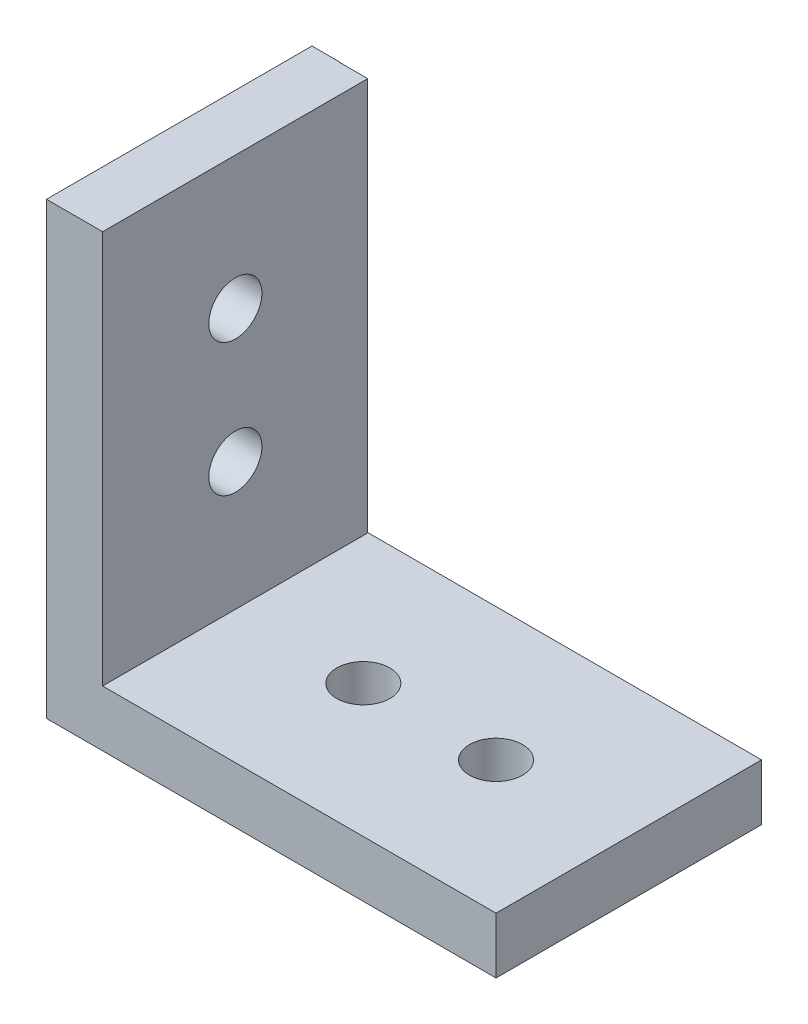
ISO-10303-21;
HEADER;
FILE_DESCRIPTION(('STEP AP214'),'2;1');
FILE_NAME('part.step','',(''),(''),'','','');
FILE_SCHEMA(('AUTOMOTIVE_DESIGN { 1 0 10303 214 1 1 1 1 }'));
ENDSEC;
DATA;
#1=APPLICATION_CONTEXT('core data for automotive mechanical design processes');
#2=APPLICATION_PROTOCOL_DEFINITION('international standard','automotive_design',2000,#1);
#3=PRODUCT_CONTEXT('',#1,'mechanical');
#4=PRODUCT('Part','Part','',(#3));
#5=PRODUCT_RELATED_PRODUCT_CATEGORY('part','',(#4));
#6=PRODUCT_DEFINITION_FORMATION('','',#4);
#7=PRODUCT_DEFINITION_CONTEXT('part definition',#1,'design');
#8=PRODUCT_DEFINITION('design','',#6,#7);
#9=PRODUCT_DEFINITION_SHAPE('','',#8);
#10=(LENGTH_UNIT() NAMED_UNIT(*) SI_UNIT(.MILLI.,.METRE.));
#11=(NAMED_UNIT(*) PLANE_ANGLE_UNIT() SI_UNIT($,.RADIAN.));
#12=(NAMED_UNIT(*) SI_UNIT($,.STERADIAN.) SOLID_ANGLE_UNIT());
#13=UNCERTAINTY_MEASURE_WITH_UNIT(LENGTH_MEASURE(1.E-05),#10,'distance_accuracy_value','');
#14=(GEOMETRIC_REPRESENTATION_CONTEXT(3) GLOBAL_UNCERTAINTY_ASSIGNED_CONTEXT((#13)) GLOBAL_UNIT_ASSIGNED_CONTEXT((#10,
#11,#12)) REPRESENTATION_CONTEXT('',''));
#15=CARTESIAN_POINT('',(0.,0.,0.));
#16=DIRECTION('',(0.,0.,1.));
#17=DIRECTION('',(1.,0.,0.));
#18=AXIS2_PLACEMENT_3D('',#15,#16,#17);
#19=CARTESIAN_POINT('',(1.5875,0.,0.));
#20=DIRECTION('',(-1.,0.,0.));
#21=DIRECTION('',(0.,0.,1.));
#22=AXIS2_PLACEMENT_3D('',#19,#20,#21);
#23=PLANE('',#22);
#24=DIRECTION('',(0.,1.,0.));
#25=VECTOR('',#24,1.);
#26=CARTESIAN_POINT('',(1.5875,25.4,-14.9789009302808));
#27=LINE('',#26,#25);
#28=CARTESIAN_POINT('',(1.5875,3.1725,-14.9789009302808));
#29=VERTEX_POINT('',#28);
#30=CARTESIAN_POINT('',(1.5875,25.4,-14.9789009302808));
#31=VERTEX_POINT('',#30);
#32=EDGE_CURVE('E115',#29,#31,#27,.T.);
#33=ORIENTED_EDGE('',*,*,#32,.F.);
#34=DIRECTION('',(0.,0.,1.));
#35=VECTOR('',#34,1.);
#36=CARTESIAN_POINT('',(1.5875,3.1725,-15.));
#37=LINE('',#36,#35);
#38=CARTESIAN_POINT('',(1.5875,3.1725,-15.));
#39=VERTEX_POINT('',#38);
#40=EDGE_CURVE('E132',#39,#29,#37,.T.);
#41=ORIENTED_EDGE('',*,*,#40,.F.);
#42=DIRECTION('',(0.,1.,0.));
#43=VECTOR('',#42,1.);
#44=CARTESIAN_POINT('',(1.5875,1.5875,-15.));
#45=LINE('',#44,#43);
#46=CARTESIAN_POINT('',(1.5875,25.4,-15.));
#47=VERTEX_POINT('',#46);
#48=EDGE_CURVE('E145',#39,#47,#45,.T.);
#49=ORIENTED_EDGE('',*,*,#48,.T.);
#50=DIRECTION('',(0.,0.,1.));
#51=VECTOR('',#50,1.);
#52=CARTESIAN_POINT('',(1.5875,25.4,0.));
#53=LINE('',#52,#51);
#54=EDGE_CURVE('E148',#47,#31,#53,.T.);
#55=ORIENTED_EDGE('',*,*,#54,.T.);
#56=EDGE_LOOP('',(#33,#41,#49,#55));
#57=FACE_BOUND('',#56,.T.);
#58=ADVANCED_FACE('F39',(#57),#23,.F.);
#59=CARTESIAN_POINT('',(3.175,0.,0.));
#60=DIRECTION('',(0.,0.,-1.));
#61=DIRECTION('',(-1.,0.,0.));
#62=AXIS2_PLACEMENT_3D('',#59,#60,#61);
#63=PLANE('',#62);
#64=DIRECTION('',(0.,-1.,0.));
#65=VECTOR('',#64,1.);
#66=CARTESIAN_POINT('',(25.4,0.,0.));
#67=LINE('',#66,#65);
#68=CARTESIAN_POINT('',(25.4,3.1725,0.));
#69=VERTEX_POINT('',#68);
#70=CARTESIAN_POINT('',(25.4,0.,0.));
#71=VERTEX_POINT('',#70);
#72=EDGE_CURVE('E128',#69,#71,#67,.T.);
#73=ORIENTED_EDGE('',*,*,#72,.F.);
#74=DIRECTION('',(1.,0.,0.));
#75=VECTOR('',#74,1.);
#76=CARTESIAN_POINT('',(1.5875,3.1725,0.));
#77=LINE('',#76,#75);
#78=CARTESIAN_POINT('',(3.1725,3.1725,0.));
#79=VERTEX_POINT('',#78);
#80=EDGE_CURVE('E121',#79,#69,#77,.T.);
#81=ORIENTED_EDGE('',*,*,#80,.F.);
#82=DIRECTION('',(0.,-1.,0.));
#83=VECTOR('',#82,1.);
#84=CARTESIAN_POINT('',(3.1725,25.4,0.));
#85=LINE('',#84,#83);
#86=CARTESIAN_POINT('',(3.1725,25.4,0.));
#87=VERTEX_POINT('',#86);
#88=EDGE_CURVE('E105',#87,#79,#85,.T.);
#89=ORIENTED_EDGE('',*,*,#88,.F.);
#90=DIRECTION('',(-1.,0.,0.));
#91=VECTOR('',#90,1.);
#92=CARTESIAN_POINT('',(3.175,25.4,0.));
#93=LINE('',#92,#91);
#94=CARTESIAN_POINT('',(0.,25.4,0.));
#95=VERTEX_POINT('',#94);
#96=EDGE_CURVE('E63',#87,#95,#93,.T.);
#97=ORIENTED_EDGE('',*,*,#96,.T.);
#98=DIRECTION('',(0.,-1.,0.));
#99=VECTOR('',#98,1.);
#100=CARTESIAN_POINT('',(0.,0.,0.));
#101=LINE('',#100,#99);
#102=CARTESIAN_POINT('',(0.,0.,0.));
#103=VERTEX_POINT('',#102);
#104=EDGE_CURVE('E177',#95,#103,#101,.T.);
#105=ORIENTED_EDGE('',*,*,#104,.T.);
#106=DIRECTION('',(-1.,0.,0.));
#107=VECTOR('',#106,1.);
#108=CARTESIAN_POINT('',(3.175,0.,0.));
#109=LINE('',#108,#107);
#110=EDGE_CURVE('E11',#71,#103,#109,.T.);
#111=ORIENTED_EDGE('',*,*,#110,.F.);
#112=EDGE_LOOP('',(#73,#81,#89,#97,#105,#111));
#113=FACE_BOUND('',#112,.T.);
#114=ADVANCED_FACE('F41',(#113),#63,.F.);
#115=CARTESIAN_POINT('',(3.175,0.,0.));
#116=DIRECTION('',(0.,1.,0.));
#117=DIRECTION('',(0.,0.,1.));
#118=AXIS2_PLACEMENT_3D('',#115,#116,#117);
#119=PLANE('',#118);
#120=CARTESIAN_POINT('',(10.4,0.,-7.5));
#121=DIRECTION('',(0.,-1.,0.));
#122=DIRECTION('',(0.,0.,-1.));
#123=AXIS2_PLACEMENT_3D('',#120,#121,#122);
#124=CIRCLE('',#123,1.5);
#125=CARTESIAN_POINT('',(10.4,0.,-9.));
#126=VERTEX_POINT('',#125);
#127=EDGE_CURVE('E153',#126,#126,#124,.T.);
#128=ORIENTED_EDGE('',*,*,#127,.F.);
#129=EDGE_LOOP('',(#128));
#130=FACE_BOUND('',#129,.T.);
#131=CARTESIAN_POINT('',(17.9,0.,-7.5));
#132=DIRECTION('',(0.,-1.,0.));
#133=DIRECTION('',(0.,0.,-1.));
#134=AXIS2_PLACEMENT_3D('',#131,#132,#133);
#135=CIRCLE('',#134,1.5);
#136=CARTESIAN_POINT('',(17.9,0.,-9.));
#137=VERTEX_POINT('',#136);
#138=EDGE_CURVE('E152',#137,#137,#135,.T.);
#139=ORIENTED_EDGE('',*,*,#138,.F.);
#140=EDGE_LOOP('',(#139));
#141=FACE_BOUND('',#140,.T.);
#142=DIRECTION('',(0.,0.,-1.));
#143=VECTOR('',#142,1.);
#144=CARTESIAN_POINT('',(0.,0.,0.));
#145=LINE('',#144,#143);
#146=CARTESIAN_POINT('',(0.,0.,-15.));
#147=VERTEX_POINT('',#146);
#148=EDGE_CURVE('E180',#103,#147,#145,.T.);
#149=ORIENTED_EDGE('',*,*,#148,.T.);
#150=DIRECTION('',(-1.,0.,0.));
#151=VECTOR('',#150,1.);
#152=CARTESIAN_POINT('',(3.175,0.,-15.));
#153=LINE('',#152,#151);
#154=CARTESIAN_POINT('',(25.4,0.,-15.));
#155=VERTEX_POINT('',#154);
#156=EDGE_CURVE('E48',#155,#147,#153,.T.);
#157=ORIENTED_EDGE('',*,*,#156,.F.);
#158=DIRECTION('',(0.,0.,-1.));
#159=VECTOR('',#158,1.);
#160=CARTESIAN_POINT('',(25.4,0.,0.));
#161=LINE('',#160,#159);
#162=EDGE_CURVE('E170',#71,#155,#161,.T.);
#163=ORIENTED_EDGE('',*,*,#162,.F.);
#164=ORIENTED_EDGE('',*,*,#110,.T.);
#165=EDGE_LOOP('',(#149,#157,#163,#164));
#166=FACE_BOUND('',#165,.T.);
#167=ADVANCED_FACE('F217',(#130,#141,#166),#119,.F.);
#168=CARTESIAN_POINT('',(3.175,0.,-15.));
#169=DIRECTION('',(0.,0.,1.));
#170=DIRECTION('',(1.,0.,0.));
#171=AXIS2_PLACEMENT_3D('',#168,#169,#170);
#172=PLANE('',#171);
#173=ORIENTED_EDGE('',*,*,#48,.F.);
#174=DIRECTION('',(-1.,0.,0.));
#175=VECTOR('',#174,1.);
#176=CARTESIAN_POINT('',(1.5875,3.1725,-15.));
#177=LINE('',#176,#175);
#178=CARTESIAN_POINT('',(25.4,3.1725,-15.));
#179=VERTEX_POINT('',#178);
#180=EDGE_CURVE('E136',#179,#39,#177,.T.);
#181=ORIENTED_EDGE('',*,*,#180,.F.);
#182=DIRECTION('',(0.,1.,0.));
#183=VECTOR('',#182,1.);
#184=CARTESIAN_POINT('',(25.4,0.,-15.));
#185=LINE('',#184,#183);
#186=EDGE_CURVE('E174',#155,#179,#185,.T.);
#187=ORIENTED_EDGE('',*,*,#186,.F.);
#188=ORIENTED_EDGE('',*,*,#156,.T.);
#189=DIRECTION('',(0.,1.,0.));
#190=VECTOR('',#189,1.);
#191=CARTESIAN_POINT('',(0.,0.,-15.));
#192=LINE('',#191,#190);
#193=CARTESIAN_POINT('',(0.,25.4,-15.));
#194=VERTEX_POINT('',#193);
#195=EDGE_CURVE('E183',#147,#194,#192,.T.);
#196=ORIENTED_EDGE('',*,*,#195,.T.);
#197=DIRECTION('',(-1.,0.,0.));
#198=VECTOR('',#197,1.);
#199=CARTESIAN_POINT('',(3.175,25.4,-15.));
#200=LINE('',#199,#198);
#201=EDGE_CURVE('E192',#47,#194,#200,.T.);
#202=ORIENTED_EDGE('',*,*,#201,.F.);
#203=EDGE_LOOP('',(#173,#181,#187,#188,#196,#202));
#204=FACE_BOUND('',#203,.T.);
#205=ADVANCED_FACE('F199',(#204),#172,.F.);
#206=CARTESIAN_POINT('',(3.175,25.4,0.));
#207=DIRECTION('',(0.,-1.,0.));
#208=DIRECTION('',(0.,0.,-1.));
#209=AXIS2_PLACEMENT_3D('',#206,#207,#208);
#210=PLANE('',#209);
#211=ORIENTED_EDGE('',*,*,#96,.F.);
#212=DIRECTION('',(0.,0.,1.));
#213=VECTOR('',#212,1.);
#214=CARTESIAN_POINT('',(3.1725,25.4,0.));
#215=LINE('',#214,#213);
#216=CARTESIAN_POINT('',(3.1725,25.4,-14.9789009302808));
#217=VERTEX_POINT('',#216);
#218=EDGE_CURVE('E112',#217,#87,#215,.T.);
#219=ORIENTED_EDGE('',*,*,#218,.F.);
#220=DIRECTION('',(-1.,0.,0.));
#221=VECTOR('',#220,1.);
#222=CARTESIAN_POINT('',(3.1725,25.4,-14.9789009302808));
#223=LINE('',#222,#221);
#224=EDGE_CURVE('E378',#217,#31,#223,.T.);
#225=ORIENTED_EDGE('',*,*,#224,.T.);
#226=ORIENTED_EDGE('',*,*,#54,.F.);
#227=ORIENTED_EDGE('',*,*,#201,.T.);
#228=DIRECTION('',(0.,0.,1.));
#229=VECTOR('',#228,1.);
#230=CARTESIAN_POINT('',(0.,25.4,0.));
#231=LINE('',#230,#229);
#232=EDGE_CURVE('E187',#194,#95,#231,.T.);
#233=ORIENTED_EDGE('',*,*,#232,.T.);
#234=EDGE_LOOP('',(#211,#219,#225,#226,#227,#233));
#235=FACE_BOUND('',#234,.T.);
#236=ADVANCED_FACE('F209',(#235),#210,.F.);
#237=CARTESIAN_POINT('',(0.,0.,0.));
#238=DIRECTION('',(-1.,0.,0.));
#239=DIRECTION('',(0.,0.,1.));
#240=AXIS2_PLACEMENT_3D('',#237,#238,#239);
#241=PLANE('',#240);
#242=CARTESIAN_POINT('',(0.,17.9,-7.5));
#243=DIRECTION('',(1.,0.,0.));
#244=DIRECTION('',(0.,0.,-1.));
#245=AXIS2_PLACEMENT_3D('',#242,#243,#244);
#246=CIRCLE('',#245,1.5);
#247=CARTESIAN_POINT('',(0.,17.9,-9.));
#248=VERTEX_POINT('',#247);
#249=EDGE_CURVE('E161',#248,#248,#246,.T.);
#250=ORIENTED_EDGE('',*,*,#249,.T.);
#251=EDGE_LOOP('',(#250));
#252=FACE_BOUND('',#251,.T.);
#253=CARTESIAN_POINT('',(0.,10.4,-7.5));
#254=DIRECTION('',(1.,0.,0.));
#255=DIRECTION('',(0.,0.,-1.));
#256=AXIS2_PLACEMENT_3D('',#253,#254,#255);
#257=CIRCLE('',#256,1.5);
#258=CARTESIAN_POINT('',(0.,10.4,-9.));
#259=VERTEX_POINT('',#258);
#260=EDGE_CURVE('E157',#259,#259,#257,.T.);
#261=ORIENTED_EDGE('',*,*,#260,.T.);
#262=EDGE_LOOP('',(#261));
#263=FACE_BOUND('',#262,.T.);
#264=ORIENTED_EDGE('',*,*,#104,.F.);
#265=ORIENTED_EDGE('',*,*,#232,.F.);
#266=ORIENTED_EDGE('',*,*,#195,.F.);
#267=ORIENTED_EDGE('',*,*,#148,.F.);
#268=EDGE_LOOP('',(#264,#265,#266,#267));
#269=FACE_BOUND('',#268,.T.);
#270=ADVANCED_FACE('F207',(#252,#263,#269),#241,.T.);
#271=CARTESIAN_POINT('',(25.4,0.,0.));
#272=DIRECTION('',(-1.,0.,0.));
#273=DIRECTION('',(0.,0.,1.));
#274=AXIS2_PLACEMENT_3D('',#271,#272,#273);
#275=PLANE('',#274);
#276=ORIENTED_EDGE('',*,*,#186,.T.);
#277=DIRECTION('',(0.,0.,-1.));
#278=VECTOR('',#277,1.);
#279=CARTESIAN_POINT('',(25.4,3.1725,-15.));
#280=LINE('',#279,#278);
#281=EDGE_CURVE('E131',#69,#179,#280,.T.);
#282=ORIENTED_EDGE('',*,*,#281,.F.);
#283=ORIENTED_EDGE('',*,*,#72,.T.);
#284=ORIENTED_EDGE('',*,*,#162,.T.);
#285=EDGE_LOOP('',(#276,#282,#283,#284));
#286=FACE_BOUND('',#285,.T.);
#287=ADVANCED_FACE('F216',(#286),#275,.F.);
#288=CARTESIAN_POINT('',(0.,10.4,-7.5));
#289=DIRECTION('',(1.,0.,0.));
#290=DIRECTION('',(0.,0.,-1.));
#291=AXIS2_PLACEMENT_3D('',#288,#289,#290);
#292=CYLINDRICAL_SURFACE('',#291,1.5);
#293=ORIENTED_EDGE('',*,*,#260,.F.);
#294=EDGE_LOOP('',(#293));
#295=FACE_BOUND('',#294,.T.);
#296=CARTESIAN_POINT('',(3.1725,10.4,-7.5));
#297=DIRECTION('',(1.,0.,0.));
#298=DIRECTION('',(0.,0.,-1.));
#299=AXIS2_PLACEMENT_3D('',#296,#297,#298);
#300=CIRCLE('',#299,1.5);
#301=CARTESIAN_POINT('',(3.1725,10.4,-9.));
#302=VERTEX_POINT('',#301);
#303=EDGE_CURVE('E405',#302,#302,#300,.T.);
#304=ORIENTED_EDGE('',*,*,#303,.T.);
#305=EDGE_LOOP('',(#304));
#306=FACE_BOUND('',#305,.T.);
#307=ADVANCED_FACE('F248',(#295,#306),#292,.F.);
#308=CARTESIAN_POINT('',(0.,17.9,-7.5));
#309=DIRECTION('',(1.,0.,0.));
#310=DIRECTION('',(0.,0.,-1.));
#311=AXIS2_PLACEMENT_3D('',#308,#309,#310);
#312=CYLINDRICAL_SURFACE('',#311,1.5);
#313=ORIENTED_EDGE('',*,*,#249,.F.);
#314=EDGE_LOOP('',(#313));
#315=FACE_BOUND('',#314,.T.);
#316=CARTESIAN_POINT('',(3.1725,17.9,-7.5));
#317=DIRECTION('',(1.,0.,0.));
#318=DIRECTION('',(0.,0.,-1.));
#319=AXIS2_PLACEMENT_3D('',#316,#317,#318);
#320=CIRCLE('',#319,1.5);
#321=CARTESIAN_POINT('',(3.1725,17.9,-9.));
#322=VERTEX_POINT('',#321);
#323=EDGE_CURVE('E380',#322,#322,#320,.T.);
#324=ORIENTED_EDGE('',*,*,#323,.T.);
#325=EDGE_LOOP('',(#324));
#326=FACE_BOUND('',#325,.T.);
#327=ADVANCED_FACE('F244',(#315,#326),#312,.F.);
#328=CARTESIAN_POINT('',(17.9,25.4,-7.5));
#329=DIRECTION('',(0.,-1.,0.));
#330=DIRECTION('',(0.,0.,-1.));
#331=AXIS2_PLACEMENT_3D('',#328,#329,#330);
#332=CYLINDRICAL_SURFACE('',#331,1.5);
#333=ORIENTED_EDGE('',*,*,#138,.T.);
#334=EDGE_LOOP('',(#333));
#335=FACE_BOUND('',#334,.T.);
#336=CARTESIAN_POINT('',(17.9,3.1725,-7.5));
#337=DIRECTION('',(0.,1.,0.));
#338=DIRECTION('',(0.,0.,1.));
#339=AXIS2_PLACEMENT_3D('',#336,#337,#338);
#340=CIRCLE('',#339,1.5);
#341=CARTESIAN_POINT('',(17.9,3.1725,-6.));
#342=VERTEX_POINT('',#341);
#343=EDGE_CURVE('E386',#342,#342,#340,.T.);
#344=ORIENTED_EDGE('',*,*,#343,.T.);
#345=EDGE_LOOP('',(#344));
#346=FACE_BOUND('',#345,.T.);
#347=ADVANCED_FACE('F240',(#335,#346),#332,.F.);
#348=CARTESIAN_POINT('',(10.4,25.4,-7.5));
#349=DIRECTION('',(0.,-1.,0.));
#350=DIRECTION('',(0.,0.,-1.));
#351=AXIS2_PLACEMENT_3D('',#348,#349,#350);
#352=CYLINDRICAL_SURFACE('',#351,1.5);
#353=ORIENTED_EDGE('',*,*,#127,.T.);
#354=EDGE_LOOP('',(#353));
#355=FACE_BOUND('',#354,.T.);
#356=CARTESIAN_POINT('',(10.4,3.1725,-7.5));
#357=DIRECTION('',(0.,1.,0.));
#358=DIRECTION('',(0.,0.,1.));
#359=AXIS2_PLACEMENT_3D('',#356,#357,#358);
#360=CIRCLE('',#359,1.5);
#361=CARTESIAN_POINT('',(10.4,3.1725,-6.));
#362=VERTEX_POINT('',#361);
#363=EDGE_CURVE('E138',#362,#362,#360,.T.);
#364=ORIENTED_EDGE('',*,*,#363,.T.);
#365=EDGE_LOOP('',(#364));
#366=FACE_BOUND('',#365,.T.);
#367=ADVANCED_FACE('F237',(#355,#366),#352,.F.);
#368=CARTESIAN_POINT('',(0.,3.1725,0.));
#369=DIRECTION('',(0.,1.,0.));
#370=DIRECTION('',(0.,0.,1.));
#371=AXIS2_PLACEMENT_3D('',#368,#369,#370);
#372=PLANE('',#371);
#373=DIRECTION('',(0.,0.,-1.));
#374=VECTOR('',#373,1.);
#375=CARTESIAN_POINT('',(3.1725,3.1725,0.));
#376=LINE('',#375,#374);
#377=CARTESIAN_POINT('',(3.1725,3.1725,-14.9789009302808));
#378=VERTEX_POINT('',#377);
#379=EDGE_CURVE('E109',#79,#378,#376,.T.);
#380=ORIENTED_EDGE('',*,*,#379,.F.);
#381=ORIENTED_EDGE('',*,*,#80,.T.);
#382=ORIENTED_EDGE('',*,*,#281,.T.);
#383=ORIENTED_EDGE('',*,*,#180,.T.);
#384=ORIENTED_EDGE('',*,*,#40,.T.);
#385=DIRECTION('',(-1.,0.,0.));
#386=VECTOR('',#385,1.);
#387=CARTESIAN_POINT('',(3.1725,3.1725,-14.9789009302808));
#388=LINE('',#387,#386);
#389=EDGE_CURVE('E124',#378,#29,#388,.T.);
#390=ORIENTED_EDGE('',*,*,#389,.F.);
#391=EDGE_LOOP('',(#380,#381,#382,#383,#384,#390));
#392=FACE_BOUND('',#391,.T.);
#393=ORIENTED_EDGE('',*,*,#363,.F.);
#394=EDGE_LOOP('',(#393));
#395=FACE_BOUND('',#394,.T.);
#396=ORIENTED_EDGE('',*,*,#343,.F.);
#397=EDGE_LOOP('',(#396));
#398=FACE_BOUND('',#397,.T.);
#399=ADVANCED_FACE('F118',(#392,#395,#398),#372,.T.);
#400=CARTESIAN_POINT('',(3.1725,0.,0.));
#401=DIRECTION('',(1.,0.,0.));
#402=DIRECTION('',(0.,0.,-1.));
#403=AXIS2_PLACEMENT_3D('',#400,#401,#402);
#404=PLANE('',#403);
#405=ORIENTED_EDGE('',*,*,#323,.F.);
#406=EDGE_LOOP('',(#405));
#407=FACE_BOUND('',#406,.T.);
#408=ORIENTED_EDGE('',*,*,#88,.T.);
#409=ORIENTED_EDGE('',*,*,#379,.T.);
#410=DIRECTION('',(0.,1.,0.));
#411=VECTOR('',#410,1.);
#412=CARTESIAN_POINT('',(3.1725,25.4,-14.9789009302808));
#413=LINE('',#412,#411);
#414=EDGE_CURVE('E55',#378,#217,#413,.T.);
#415=ORIENTED_EDGE('',*,*,#414,.T.);
#416=ORIENTED_EDGE('',*,*,#218,.T.);
#417=EDGE_LOOP('',(#408,#409,#415,#416));
#418=FACE_BOUND('',#417,.T.);
#419=ORIENTED_EDGE('',*,*,#303,.F.);
#420=EDGE_LOOP('',(#419));
#421=FACE_BOUND('',#420,.T.);
#422=ADVANCED_FACE('F107',(#407,#418,#421),#404,.T.);
#423=CARTESIAN_POINT('',(3.1725,25.4,-14.9789009302808));
#424=DIRECTION('',(0.,0.,1.));
#425=DIRECTION('',(1.,0.,0.));
#426=AXIS2_PLACEMENT_3D('',#423,#424,#425);
#427=PLANE('',#426);
#428=ORIENTED_EDGE('',*,*,#32,.T.);
#429=ORIENTED_EDGE('',*,*,#224,.F.);
#430=ORIENTED_EDGE('',*,*,#414,.F.);
#431=ORIENTED_EDGE('',*,*,#389,.T.);
#432=EDGE_LOOP('',(#428,#429,#430,#431));
#433=FACE_BOUND('',#432,.T.);
#434=ADVANCED_FACE('F293',(#433),#427,.F.);
#435=CLOSED_SHELL('',(#58,#114,#167,#205,#236,#270,#287,#307,#327,#347,#367,#399,#422,#434));
#436=MANIFOLD_SOLID_BREP('B2',#435);
#437=ADVANCED_BREP_SHAPE_REPRESENTATION('',(#18,#436),#14);
#438=SHAPE_DEFINITION_REPRESENTATION(#9,#437);
ENDSEC;
END-ISO-10303-21;
